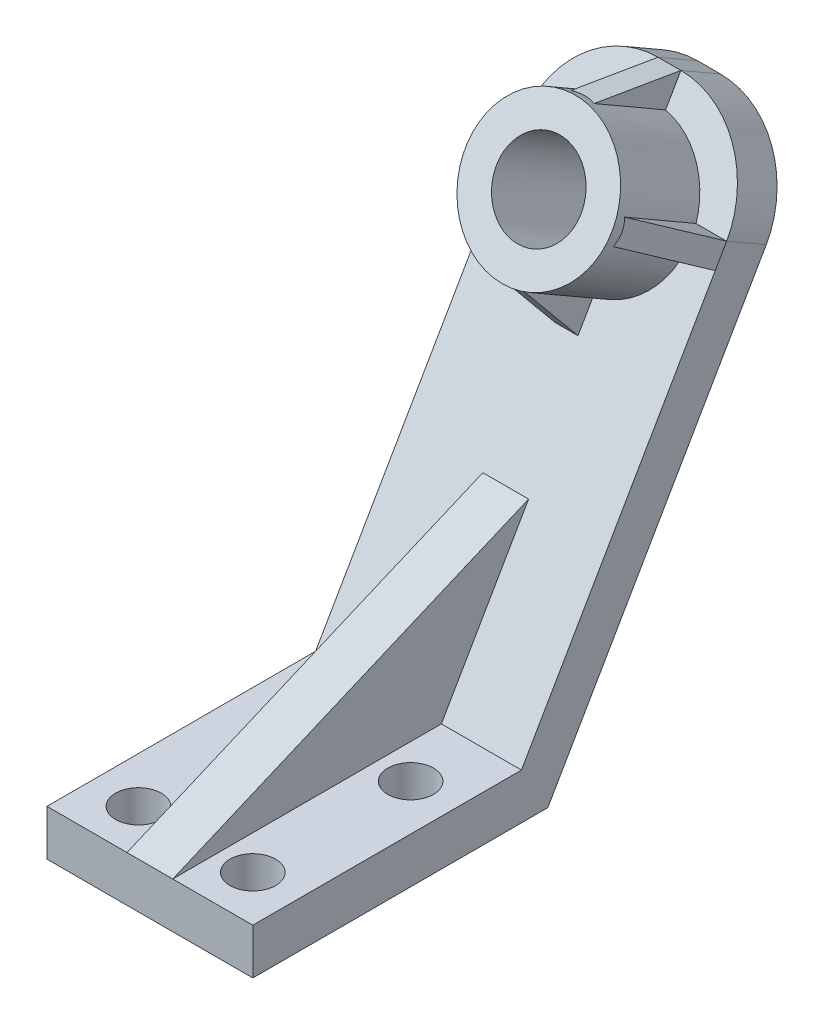
ISO-10303-21;
HEADER;
FILE_DESCRIPTION(('STEP AP214'),'2;1');
FILE_NAME('part.step','',(''),(''),'','','');
FILE_SCHEMA(('AUTOMOTIVE_DESIGN { 1 0 10303 214 1 1 1 1 }'));
ENDSEC;
DATA;
#1=APPLICATION_CONTEXT('core data for automotive mechanical design processes');
#2=APPLICATION_PROTOCOL_DEFINITION('international standard','automotive_design',2000,#1);
#3=PRODUCT_CONTEXT('',#1,'mechanical');
#4=PRODUCT('Part','Part','',(#3));
#5=PRODUCT_RELATED_PRODUCT_CATEGORY('part','',(#4));
#6=PRODUCT_DEFINITION_FORMATION('','',#4);
#7=PRODUCT_DEFINITION_CONTEXT('part definition',#1,'design');
#8=PRODUCT_DEFINITION('design','',#6,#7);
#9=PRODUCT_DEFINITION_SHAPE('','',#8);
#10=(LENGTH_UNIT() NAMED_UNIT(*) SI_UNIT(.MILLI.,.METRE.));
#11=(NAMED_UNIT(*) PLANE_ANGLE_UNIT() SI_UNIT($,.RADIAN.));
#12=(NAMED_UNIT(*) SI_UNIT($,.STERADIAN.) SOLID_ANGLE_UNIT());
#13=UNCERTAINTY_MEASURE_WITH_UNIT(LENGTH_MEASURE(1.E-05),#10,'distance_accuracy_value','');
#14=(GEOMETRIC_REPRESENTATION_CONTEXT(3) GLOBAL_UNCERTAINTY_ASSIGNED_CONTEXT((#13)) GLOBAL_UNIT_ASSIGNED_CONTEXT((#10,
#11,#12)) REPRESENTATION_CONTEXT('',''));
#15=CARTESIAN_POINT('',(0.,0.,0.));
#16=DIRECTION('',(0.,0.,1.));
#17=DIRECTION('',(1.,0.,0.));
#18=AXIS2_PLACEMENT_3D('',#15,#16,#17);
#19=CARTESIAN_POINT('',(45.,210.051868274206,-227.179491924311));
#20=DIRECTION('',(0.,-0.499999999999998,-0.86602540378444));
#21=DIRECTION('',(0.,0.86602540378444,-0.499999999999998));
#22=AXIS2_PLACEMENT_3D('',#19,#20,#21);
#23=PLANE('',#22);
#24=DIRECTION('',(-1.,0.,0.));
#25=VECTOR('',#24,1.);
#26=CARTESIAN_POINT('',(45.0000000000004,175.410852122828,-207.179491924311));
#27=LINE('',#26,#25);
#28=CARTESIAN_POINT('',(45.,175.410852122828,-207.179491924311));
#29=VERTEX_POINT('',#28);
#30=CARTESIAN_POINT('',(31.6069612585582,175.410852122828,-207.179491924311));
#31=VERTEX_POINT('',#30);
#32=EDGE_CURVE('E186',#29,#31,#27,.T.);
#33=ORIENTED_EDGE('',*,*,#32,.F.);
#34=CARTESIAN_POINT('',(5.,175.410852122828,-207.179491924311));
#35=DIRECTION('',(0.,-0.499999999999998,-0.86602540378444));
#36=DIRECTION('',(0.,0.86602540378444,-0.499999999999998));
#37=AXIS2_PLACEMENT_3D('',#34,#35,#36);
#38=CIRCLE('',#37,40.);
#39=CARTESIAN_POINT('',(5.00000000000001,210.051868274206,-227.179491924311));
#40=VERTEX_POINT('',#39);
#41=EDGE_CURVE('E361',#29,#40,#38,.F.);
#42=ORIENTED_EDGE('',*,*,#41,.T.);
#43=DIRECTION('',(0.,-0.86602540378444,0.499999999999998));
#44=VECTOR('',#43,1.);
#45=CARTESIAN_POINT('',(5.,210.051868274206,-227.179491924311));
#46=LINE('',#45,#44);
#47=CARTESIAN_POINT('',(5.,198.453156490248,-220.48297255359));
#48=VERTEX_POINT('',#47);
#49=EDGE_CURVE('E254',#40,#48,#46,.T.);
#50=ORIENTED_EDGE('',*,*,#49,.T.);
#51=CARTESIAN_POINT('',(0.,171.080725103906,-204.679491924311));
#52=DIRECTION('',(0.,-0.499999999999998,-0.86602540378444));
#53=DIRECTION('',(0.,0.86602540378444,-0.499999999999998));
#54=AXIS2_PLACEMENT_3D('',#51,#52,#53);
#55=CIRCLE('',#54,32.);
#56=EDGE_CURVE('E42',#31,#48,#55,.F.);
#57=ORIENTED_EDGE('',*,*,#56,.F.);
#58=EDGE_LOOP('',(#33,#42,#50,#57));
#59=FACE_BOUND('',#58,.T.);
#60=ADVANCED_FACE('F33',(#59),#23,.F.);
#61=CARTESIAN_POINT('',(-5.,175.410852122828,-207.179491924311));
#62=DIRECTION('',(0.,-0.499999999999998,-0.86602540378444));
#63=DIRECTION('',(0.,0.86602540378444,-0.499999999999998));
#64=AXIS2_PLACEMENT_3D('',#61,#62,#63);
#65=CIRCLE('',#64,40.);
#66=CARTESIAN_POINT('',(-4.99999999999998,210.051868274206,-227.179491924311));
#67=VERTEX_POINT('',#66);
#68=CARTESIAN_POINT('',(-45.,175.410852122828,-207.179491924311));
#69=VERTEX_POINT('',#68);
#70=EDGE_CURVE('E359',#67,#69,#65,.F.);
#71=ORIENTED_EDGE('',*,*,#70,.T.);
#72=DIRECTION('',(1.,0.,0.));
#73=VECTOR('',#72,1.);
#74=CARTESIAN_POINT('',(45.0000000000001,175.410852122828,-207.179491924311));
#75=LINE('',#74,#73);
#76=CARTESIAN_POINT('',(-31.6069612585582,175.410852122828,-207.179491924311));
#77=VERTEX_POINT('',#76);
#78=EDGE_CURVE('E237',#69,#77,#75,.T.);
#79=ORIENTED_EDGE('',*,*,#78,.T.);
#80=CARTESIAN_POINT('',(-5.,198.453156490248,-220.48297255359));
#81=VERTEX_POINT('',#80);
#82=EDGE_CURVE('E11',#81,#77,#55,.F.);
#83=ORIENTED_EDGE('',*,*,#82,.F.);
#84=DIRECTION('',(0.,-0.86602540378444,0.499999999999998));
#85=VECTOR('',#84,1.);
#86=CARTESIAN_POINT('',(-5.,210.051868274206,-227.179491924311));
#87=LINE('',#86,#85);
#88=EDGE_CURVE('E246',#67,#81,#87,.T.);
#89=ORIENTED_EDGE('',*,*,#88,.F.);
#90=EDGE_LOOP('',(#71,#79,#83,#89));
#91=FACE_BOUND('',#90,.T.);
#92=ADVANCED_FACE('F406',(#91),#23,.F.);
#93=CARTESIAN_POINT('',(45.,20.,-117.452994616208));
#94=DIRECTION('',(0.,-1.,0.));
#95=DIRECTION('',(0.,0.,-1.));
#96=AXIS2_PLACEMENT_3D('',#93,#94,#95);
#97=PLANE('',#96);
#98=CARTESIAN_POINT('',(-25.,20.,-89.));
#99=DIRECTION('',(0.,1.,0.));
#100=DIRECTION('',(0.,0.,1.));
#101=AXIS2_PLACEMENT_3D('',#98,#99,#100);
#102=CIRCLE('',#101,10.);
#103=CARTESIAN_POINT('',(-25.,20.,-79.));
#104=VERTEX_POINT('',#103);
#105=EDGE_CURVE('E275',#104,#104,#102,.T.);
#106=ORIENTED_EDGE('',*,*,#105,.F.);
#107=EDGE_LOOP('',(#106));
#108=FACE_BOUND('',#107,.T.);
#109=CARTESIAN_POINT('',(-25.,20.,-20.));
#110=DIRECTION('',(0.,1.,0.));
#111=DIRECTION('',(0.,0.,1.));
#112=AXIS2_PLACEMENT_3D('',#109,#110,#111);
#113=CIRCLE('',#112,10.);
#114=CARTESIAN_POINT('',(-25.,20.,-9.99999999999999));
#115=VERTEX_POINT('',#114);
#116=EDGE_CURVE('E274',#115,#115,#113,.T.);
#117=ORIENTED_EDGE('',*,*,#116,.F.);
#118=EDGE_LOOP('',(#117));
#119=FACE_BOUND('',#118,.T.);
#120=DIRECTION('',(0.,0.,1.));
#121=VECTOR('',#120,1.);
#122=CARTESIAN_POINT('',(-10.,20.,-117.452994616208));
#123=LINE('',#122,#121);
#124=CARTESIAN_POINT('',(-9.99999999999999,20.,-117.452994616208));
#125=VERTEX_POINT('',#124);
#126=CARTESIAN_POINT('',(-10.,20.,0.));
#127=VERTEX_POINT('',#126);
#128=EDGE_CURVE('E351',#125,#127,#123,.T.);
#129=ORIENTED_EDGE('',*,*,#128,.F.);
#130=DIRECTION('',(-1.,0.,0.));
#131=VECTOR('',#130,1.);
#132=CARTESIAN_POINT('',(45.,20.,-117.452994616208));
#133=LINE('',#132,#131);
#134=CARTESIAN_POINT('',(-45.,20.,-117.452994616208));
#135=VERTEX_POINT('',#134);
#136=EDGE_CURVE('E336',#125,#135,#133,.T.);
#137=ORIENTED_EDGE('',*,*,#136,.T.);
#138=DIRECTION('',(0.,0.,1.));
#139=VECTOR('',#138,1.);
#140=CARTESIAN_POINT('',(-45.,20.,-117.452994616208));
#141=LINE('',#140,#139);
#142=CARTESIAN_POINT('',(-45.,20.,0.));
#143=VERTEX_POINT('',#142);
#144=EDGE_CURVE('E312',#135,#143,#141,.T.);
#145=ORIENTED_EDGE('',*,*,#144,.T.);
#146=DIRECTION('',(-1.,0.,0.));
#147=VECTOR('',#146,1.);
#148=CARTESIAN_POINT('',(45.,20.,0.));
#149=LINE('',#148,#147);
#150=EDGE_CURVE('E319',#127,#143,#149,.T.);
#151=ORIENTED_EDGE('',*,*,#150,.F.);
#152=EDGE_LOOP('',(#129,#137,#145,#151));
#153=FACE_BOUND('',#152,.T.);
#154=ADVANCED_FACE('F412',(#108,#119,#153),#97,.F.);
#155=CARTESIAN_POINT('',(45.,0.,0.));
#156=DIRECTION('',(0.,0.,-1.));
#157=DIRECTION('',(-1.,0.,0.));
#158=AXIS2_PLACEMENT_3D('',#155,#156,#157);
#159=PLANE('',#158);
#160=CARTESIAN_POINT('',(10.,20.,0.));
#161=VERTEX_POINT('',#160);
#162=EDGE_CURVE('E337',#161,#127,#149,.T.);
#163=ORIENTED_EDGE('',*,*,#162,.T.);
#164=ORIENTED_EDGE('',*,*,#150,.T.);
#165=DIRECTION('',(0.,-1.,0.));
#166=VECTOR('',#165,1.);
#167=CARTESIAN_POINT('',(-45.,0.,0.));
#168=LINE('',#167,#166);
#169=CARTESIAN_POINT('',(-45.,0.,0.));
#170=VERTEX_POINT('',#169);
#171=EDGE_CURVE('E307',#143,#170,#168,.T.);
#172=ORIENTED_EDGE('',*,*,#171,.T.);
#173=DIRECTION('',(-1.,0.,0.));
#174=VECTOR('',#173,1.);
#175=CARTESIAN_POINT('',(45.,0.,0.));
#176=LINE('',#175,#174);
#177=CARTESIAN_POINT('',(45.,0.,0.));
#178=VERTEX_POINT('',#177);
#179=EDGE_CURVE('E349',#178,#170,#176,.T.);
#180=ORIENTED_EDGE('',*,*,#179,.F.);
#181=DIRECTION('',(0.,-1.,0.));
#182=VECTOR('',#181,1.);
#183=CARTESIAN_POINT('',(45.,0.,0.));
#184=LINE('',#183,#182);
#185=CARTESIAN_POINT('',(45.,20.,0.));
#186=VERTEX_POINT('',#185);
#187=EDGE_CURVE('E308',#186,#178,#184,.T.);
#188=ORIENTED_EDGE('',*,*,#187,.F.);
#189=EDGE_CURVE('E333',#186,#161,#149,.T.);
#190=ORIENTED_EDGE('',*,*,#189,.T.);
#191=EDGE_LOOP('',(#163,#164,#172,#180,#188,#190));
#192=FACE_BOUND('',#191,.T.);
#193=ADVANCED_FACE('F437',(#192),#159,.F.);
#194=CARTESIAN_POINT('',(45.,0.,0.));
#195=DIRECTION('',(0.,1.,0.));
#196=DIRECTION('',(0.,0.,1.));
#197=AXIS2_PLACEMENT_3D('',#194,#195,#196);
#198=PLANE('',#197);
#199=CARTESIAN_POINT('',(25.,0.,-20.));
#200=DIRECTION('',(0.,1.,0.));
#201=DIRECTION('',(0.,0.,-1.));
#202=AXIS2_PLACEMENT_3D('',#199,#200,#201);
#203=CIRCLE('',#202,10.);
#204=CARTESIAN_POINT('',(25.,0.,-30.));
#205=VERTEX_POINT('',#204);
#206=EDGE_CURVE('E278',#205,#205,#203,.T.);
#207=ORIENTED_EDGE('',*,*,#206,.T.);
#208=EDGE_LOOP('',(#207));
#209=FACE_BOUND('',#208,.T.);
#210=CARTESIAN_POINT('',(25.,0.,-89.));
#211=DIRECTION('',(0.,1.,0.));
#212=DIRECTION('',(0.,0.,-1.));
#213=AXIS2_PLACEMENT_3D('',#210,#211,#212);
#214=CIRCLE('',#213,10.);
#215=CARTESIAN_POINT('',(25.,0.,-98.9999999999999));
#216=VERTEX_POINT('',#215);
#217=EDGE_CURVE('E284',#216,#216,#214,.T.);
#218=ORIENTED_EDGE('',*,*,#217,.T.);
#219=EDGE_LOOP('',(#218));
#220=FACE_BOUND('',#219,.T.);
#221=ORIENTED_EDGE('',*,*,#179,.T.);
#222=DIRECTION('',(0.,0.,-1.));
#223=VECTOR('',#222,1.);
#224=CARTESIAN_POINT('',(-45.,0.,0.));
#225=LINE('',#224,#223);
#226=CARTESIAN_POINT('',(-45.,0.,-129.));
#227=VERTEX_POINT('',#226);
#228=EDGE_CURVE('E322',#170,#227,#225,.T.);
#229=ORIENTED_EDGE('',*,*,#228,.T.);
#230=DIRECTION('',(-1.,0.,0.));
#231=VECTOR('',#230,1.);
#232=CARTESIAN_POINT('',(45.,0.,-129.));
#233=LINE('',#232,#231);
#234=CARTESIAN_POINT('',(45.,0.,-129.));
#235=VERTEX_POINT('',#234);
#236=EDGE_CURVE('E347',#235,#227,#233,.T.);
#237=ORIENTED_EDGE('',*,*,#236,.F.);
#238=DIRECTION('',(0.,0.,-1.));
#239=VECTOR('',#238,1.);
#240=CARTESIAN_POINT('',(45.,0.,0.));
#241=LINE('',#240,#239);
#242=EDGE_CURVE('E311',#178,#235,#241,.T.);
#243=ORIENTED_EDGE('',*,*,#242,.F.);
#244=EDGE_LOOP('',(#221,#229,#237,#243));
#245=FACE_BOUND('',#244,.T.);
#246=CARTESIAN_POINT('',(-25.,0.,-20.));
#247=DIRECTION('',(0.,1.,0.));
#248=DIRECTION('',(0.,0.,1.));
#249=AXIS2_PLACEMENT_3D('',#246,#247,#248);
#250=CIRCLE('',#249,10.);
#251=CARTESIAN_POINT('',(-25.,0.,-10.));
#252=VERTEX_POINT('',#251);
#253=EDGE_CURVE('E289',#252,#252,#250,.T.);
#254=ORIENTED_EDGE('',*,*,#253,.T.);
#255=EDGE_LOOP('',(#254));
#256=FACE_BOUND('',#255,.T.);
#257=CARTESIAN_POINT('',(-25.,0.,-89.));
#258=DIRECTION('',(0.,1.,0.));
#259=DIRECTION('',(0.,0.,1.));
#260=AXIS2_PLACEMENT_3D('',#257,#258,#259);
#261=CIRCLE('',#260,10.);
#262=CARTESIAN_POINT('',(-25.,0.,-79.));
#263=VERTEX_POINT('',#262);
#264=EDGE_CURVE('E271',#263,#263,#261,.T.);
#265=ORIENTED_EDGE('',*,*,#264,.T.);
#266=EDGE_LOOP('',(#265));
#267=FACE_BOUND('',#266,.T.);
#268=ADVANCED_FACE('F430',(#209,#220,#245,#256,#267),#198,.F.);
#269=CARTESIAN_POINT('',(45.,0.,-129.));
#270=DIRECTION('',(0.,0.499999999999998,0.86602540378444));
#271=DIRECTION('',(0.,-0.86602540378444,0.499999999999998));
#272=AXIS2_PLACEMENT_3D('',#269,#270,#271);
#273=PLANE('',#272);
#274=CARTESIAN_POINT('',(0.,161.080725103906,-222.));
#275=DIRECTION('',(0.,0.499999999999998,0.86602540378444));
#276=DIRECTION('',(0.,-0.86602540378444,0.499999999999998));
#277=AXIS2_PLACEMENT_3D('',#274,#275,#276);
#278=CIRCLE('',#277,18.5);
#279=CARTESIAN_POINT('',(0.,145.059255133894,-212.75));
#280=VERTEX_POINT('',#279);
#281=EDGE_CURVE('E264',#280,#280,#278,.T.);
#282=ORIENTED_EDGE('',*,*,#281,.T.);
#283=EDGE_LOOP('',(#282));
#284=FACE_BOUND('',#283,.T.);
#285=DIRECTION('',(0.,0.86602540378444,-0.499999999999998));
#286=VECTOR('',#285,1.);
#287=CARTESIAN_POINT('',(-45.,0.,-129.));
#288=LINE('',#287,#286);
#289=CARTESIAN_POINT('',(-45.,165.410852122828,-224.5));
#290=VERTEX_POINT('',#289);
#291=EDGE_CURVE('E325',#227,#290,#288,.T.);
#292=ORIENTED_EDGE('',*,*,#291,.T.);
#293=CARTESIAN_POINT('',(-5.,165.410852122828,-224.5));
#294=DIRECTION('',(0.,0.499999999999998,0.86602540378444));
#295=DIRECTION('',(0.,-0.86602540378444,0.499999999999998));
#296=AXIS2_PLACEMENT_3D('',#293,#294,#295);
#297=CIRCLE('',#296,40.);
#298=CARTESIAN_POINT('',(-4.99999999999998,200.051868274206,-244.499999999999));
#299=VERTEX_POINT('',#298);
#300=EDGE_CURVE('E368',#290,#299,#297,.F.);
#301=ORIENTED_EDGE('',*,*,#300,.T.);
#302=DIRECTION('',(-1.,0.,0.));
#303=VECTOR('',#302,1.);
#304=CARTESIAN_POINT('',(45.,200.051868274206,-244.499999999999));
#305=LINE('',#304,#303);
#306=CARTESIAN_POINT('',(5.00000000000001,200.051868274206,-244.499999999999));
#307=VERTEX_POINT('',#306);
#308=EDGE_CURVE('E344',#307,#299,#305,.T.);
#309=ORIENTED_EDGE('',*,*,#308,.F.);
#310=CARTESIAN_POINT('',(5.,165.410852122828,-224.5));
#311=DIRECTION('',(0.,0.499999999999998,0.86602540378444));
#312=DIRECTION('',(0.,-0.86602540378444,0.499999999999998));
#313=AXIS2_PLACEMENT_3D('',#310,#311,#312);
#314=CIRCLE('',#313,40.);
#315=CARTESIAN_POINT('',(45.,165.410852122828,-224.5));
#316=VERTEX_POINT('',#315);
#317=EDGE_CURVE('E370',#307,#316,#314,.F.);
#318=ORIENTED_EDGE('',*,*,#317,.T.);
#319=DIRECTION('',(0.,0.86602540378444,-0.499999999999998));
#320=VECTOR('',#319,1.);
#321=CARTESIAN_POINT('',(45.,0.,-129.));
#322=LINE('',#321,#320);
#323=EDGE_CURVE('E314',#235,#316,#322,.T.);
#324=ORIENTED_EDGE('',*,*,#323,.F.);
#325=ORIENTED_EDGE('',*,*,#236,.T.);
#326=EDGE_LOOP('',(#292,#301,#309,#318,#324,#325));
#327=FACE_BOUND('',#326,.T.);
#328=ADVANCED_FACE('F425',(#284,#327),#273,.F.);
#329=CARTESIAN_POINT('',(45.,200.051868274206,-244.499999999999));
#330=DIRECTION('',(0.,-0.86602540378444,0.499999999999998));
#331=DIRECTION('',(0.,-0.499999999999998,-0.86602540378444));
#332=AXIS2_PLACEMENT_3D('',#329,#330,#331);
#333=PLANE('',#332);
#334=DIRECTION('',(-1.,0.,0.));
#335=VECTOR('',#334,1.);
#336=CARTESIAN_POINT('',(45.,210.051868274206,-227.179491924311));
#337=LINE('',#336,#335);
#338=EDGE_CURVE('E341',#40,#67,#337,.T.);
#339=ORIENTED_EDGE('',*,*,#338,.F.);
#340=DIRECTION('',(0.,0.499999999999998,0.86602540378444));
#341=VECTOR('',#340,1.);
#342=CARTESIAN_POINT('',(5.,200.051868274206,-244.499999999999));
#343=LINE('',#342,#341);
#344=EDGE_CURVE('E366',#40,#307,#343,.F.);
#345=ORIENTED_EDGE('',*,*,#344,.T.);
#346=ORIENTED_EDGE('',*,*,#308,.T.);
#347=DIRECTION('',(0.,0.499999999999998,0.86602540378444));
#348=VECTOR('',#347,1.);
#349=CARTESIAN_POINT('',(-5.,200.051868274206,-244.499999999999));
#350=LINE('',#349,#348);
#351=EDGE_CURVE('E363',#299,#67,#350,.T.);
#352=ORIENTED_EDGE('',*,*,#351,.T.);
#353=EDGE_LOOP('',(#339,#345,#346,#352));
#354=FACE_BOUND('',#353,.T.);
#355=ADVANCED_FACE('F418',(#354),#333,.F.);
#356=DIRECTION('',(0.,-0.86602540378444,0.499999999999998));
#357=VECTOR('',#356,1.);
#358=CARTESIAN_POINT('',(45.,210.051868274206,-227.179491924311));
#359=LINE('',#358,#357);
#360=CARTESIAN_POINT('',(45.,166.750598084984,-202.179491924311));
#361=VERTEX_POINT('',#360);
#362=CARTESIAN_POINT('',(45.,20.,-117.452994616208));
#363=VERTEX_POINT('',#362);
#364=EDGE_CURVE('E49',#361,#363,#359,.T.);
#365=ORIENTED_EDGE('',*,*,#364,.F.);
#366=DIRECTION('',(-1.,0.,0.));
#367=VECTOR('',#366,1.);
#368=CARTESIAN_POINT('',(45.0000000000005,166.750598084984,-202.179491924311));
#369=LINE('',#368,#367);
#370=CARTESIAN_POINT('',(31.6069612585583,166.750598084984,-202.179491924311));
#371=VERTEX_POINT('',#370);
#372=EDGE_CURVE('E199',#361,#371,#369,.T.);
#373=ORIENTED_EDGE('',*,*,#372,.T.);
#374=CARTESIAN_POINT('',(5.,143.708293717564,-188.876011295032));
#375=VERTEX_POINT('',#374);
#376=EDGE_CURVE('E379',#375,#371,#55,.F.);
#377=ORIENTED_EDGE('',*,*,#376,.F.);
#378=DIRECTION('',(0.,0.86602540378444,-0.499999999999998));
#379=VECTOR('',#378,1.);
#380=CARTESIAN_POINT('',(5.,210.051868274206,-227.179491924311));
#381=LINE('',#380,#379);
#382=CARTESIAN_POINT('',(5.,132.109581933606,-182.179491924311));
#383=VERTEX_POINT('',#382);
#384=EDGE_CURVE('E217',#383,#375,#381,.T.);
#385=ORIENTED_EDGE('',*,*,#384,.F.);
#386=DIRECTION('',(1.,0.,0.));
#387=VECTOR('',#386,1.);
#388=CARTESIAN_POINT('',(45.,132.109581933606,-182.179491924311));
#389=LINE('',#388,#387);
#390=CARTESIAN_POINT('',(-5.,132.109581933606,-182.179491924311));
#391=VERTEX_POINT('',#390);
#392=EDGE_CURVE('E222',#383,#391,#389,.F.);
#393=ORIENTED_EDGE('',*,*,#392,.T.);
#394=DIRECTION('',(0.,0.86602540378444,-0.499999999999998));
#395=VECTOR('',#394,1.);
#396=CARTESIAN_POINT('',(-5.,210.051868274206,-227.179491924311));
#397=LINE('',#396,#395);
#398=CARTESIAN_POINT('',(-5.,143.708293717564,-188.876011295032));
#399=VERTEX_POINT('',#398);
#400=EDGE_CURVE('E212',#391,#399,#397,.T.);
#401=ORIENTED_EDGE('',*,*,#400,.T.);
#402=CARTESIAN_POINT('',(-31.6069612585582,166.750598084984,-202.179491924311));
#403=VERTEX_POINT('',#402);
#404=EDGE_CURVE('E41',#403,#399,#55,.F.);
#405=ORIENTED_EDGE('',*,*,#404,.F.);
#406=DIRECTION('',(1.,0.,0.));
#407=VECTOR('',#406,1.);
#408=CARTESIAN_POINT('',(45.0000000000002,166.750598084984,-202.179491924311));
#409=LINE('',#408,#407);
#410=CARTESIAN_POINT('',(-45.,166.750598084984,-202.179491924311));
#411=VERTEX_POINT('',#410);
#412=EDGE_CURVE('E228',#411,#403,#409,.T.);
#413=ORIENTED_EDGE('',*,*,#412,.F.);
#414=DIRECTION('',(0.,-0.86602540378444,0.499999999999998));
#415=VECTOR('',#414,1.);
#416=CARTESIAN_POINT('',(-45.,210.051868274206,-227.179491924311));
#417=LINE('',#416,#415);
#418=EDGE_CURVE('E327',#411,#135,#417,.T.);
#419=ORIENTED_EDGE('',*,*,#418,.T.);
#420=ORIENTED_EDGE('',*,*,#136,.F.);
#421=DIRECTION('',(0.,-0.86602540378444,0.499999999999998));
#422=VECTOR('',#421,1.);
#423=CARTESIAN_POINT('',(-10.,210.051868274206,-227.179491924311));
#424=LINE('',#423,#422);
#425=CARTESIAN_POINT('',(-10.,86.04040267284,-155.581438876763));
#426=VERTEX_POINT('',#425);
#427=EDGE_CURVE('E298',#426,#125,#424,.T.);
#428=ORIENTED_EDGE('',*,*,#427,.F.);
#429=DIRECTION('',(-1.,0.,0.));
#430=VECTOR('',#429,1.);
#431=CARTESIAN_POINT('',(45.,86.0404026728399,-155.581438876763));
#432=LINE('',#431,#430);
#433=CARTESIAN_POINT('',(9.99999999999999,86.0404026728399,-155.581438876763));
#434=VERTEX_POINT('',#433);
#435=EDGE_CURVE('E305',#426,#434,#432,.F.);
#436=ORIENTED_EDGE('',*,*,#435,.T.);
#437=DIRECTION('',(0.,-0.86602540378444,0.499999999999998));
#438=VECTOR('',#437,1.);
#439=CARTESIAN_POINT('',(10.,210.051868274206,-227.179491924311));
#440=LINE('',#439,#438);
#441=CARTESIAN_POINT('',(10.,20.,-117.452994616208));
#442=VERTEX_POINT('',#441);
#443=EDGE_CURVE('E303',#434,#442,#440,.T.);
#444=ORIENTED_EDGE('',*,*,#443,.T.);
#445=EDGE_CURVE('E338',#363,#442,#133,.T.);
#446=ORIENTED_EDGE('',*,*,#445,.F.);
#447=EDGE_LOOP('',(#365,#373,#377,#385,#393,#401,#405,#413,#419,#420,#428,#436,#444,#446));
#448=FACE_BOUND('',#447,.T.);
#449=ADVANCED_FACE('F395',(#448),#23,.F.);
#450=CARTESIAN_POINT('',(25.,20.,-20.));
#451=DIRECTION('',(0.,1.,0.));
#452=DIRECTION('',(0.,0.,-1.));
#453=AXIS2_PLACEMENT_3D('',#450,#451,#452);
#454=CIRCLE('',#453,10.);
#455=CARTESIAN_POINT('',(25.,20.,-30.));
#456=VERTEX_POINT('',#455);
#457=EDGE_CURVE('E281',#456,#456,#454,.T.);
#458=ORIENTED_EDGE('',*,*,#457,.F.);
#459=EDGE_LOOP('',(#458));
#460=FACE_BOUND('',#459,.T.);
#461=CARTESIAN_POINT('',(25.,20.,-89.));
#462=DIRECTION('',(0.,1.,0.));
#463=DIRECTION('',(0.,0.,-1.));
#464=AXIS2_PLACEMENT_3D('',#461,#462,#463);
#465=CIRCLE('',#464,10.);
#466=CARTESIAN_POINT('',(25.,20.,-98.9999999999999));
#467=VERTEX_POINT('',#466);
#468=EDGE_CURVE('E270',#467,#467,#465,.T.);
#469=ORIENTED_EDGE('',*,*,#468,.F.);
#470=EDGE_LOOP('',(#469));
#471=FACE_BOUND('',#470,.T.);
#472=ORIENTED_EDGE('',*,*,#445,.T.);
#473=DIRECTION('',(0.,0.,1.));
#474=VECTOR('',#473,1.);
#475=CARTESIAN_POINT('',(10.,20.,-117.452994616208));
#476=LINE('',#475,#474);
#477=EDGE_CURVE('E354',#442,#161,#476,.T.);
#478=ORIENTED_EDGE('',*,*,#477,.T.);
#479=ORIENTED_EDGE('',*,*,#189,.F.);
#480=DIRECTION('',(0.,0.,1.));
#481=VECTOR('',#480,1.);
#482=CARTESIAN_POINT('',(45.,20.,-117.452994616208));
#483=LINE('',#482,#481);
#484=EDGE_CURVE('E317',#363,#186,#483,.T.);
#485=ORIENTED_EDGE('',*,*,#484,.F.);
#486=EDGE_LOOP('',(#472,#478,#479,#485));
#487=FACE_BOUND('',#486,.T.);
#488=ADVANCED_FACE('F417',(#460,#471,#487),#97,.F.);
#489=CARTESIAN_POINT('',(45.,0.,0.));
#490=DIRECTION('',(1.,0.,0.));
#491=DIRECTION('',(0.,0.,-1.));
#492=AXIS2_PLACEMENT_3D('',#489,#490,#491);
#493=PLANE('',#492);
#494=ORIENTED_EDGE('',*,*,#323,.T.);
#495=DIRECTION('',(0.,0.499999999999998,0.86602540378444));
#496=VECTOR('',#495,1.);
#497=CARTESIAN_POINT('',(45.,175.410852122828,-207.179491924311));
#498=LINE('',#497,#496);
#499=EDGE_CURVE('E356',#316,#29,#498,.T.);
#500=ORIENTED_EDGE('',*,*,#499,.T.);
#501=EDGE_CURVE('E196',#29,#361,#359,.T.);
#502=ORIENTED_EDGE('',*,*,#501,.T.);
#503=ORIENTED_EDGE('',*,*,#364,.T.);
#504=ORIENTED_EDGE('',*,*,#484,.T.);
#505=ORIENTED_EDGE('',*,*,#187,.T.);
#506=ORIENTED_EDGE('',*,*,#242,.T.);
#507=EDGE_LOOP('',(#494,#500,#502,#503,#504,#505,#506));
#508=FACE_BOUND('',#507,.T.);
#509=ADVANCED_FACE('F423',(#508),#493,.T.);
#510=CARTESIAN_POINT('',(-45.,0.,0.));
#511=DIRECTION('',(1.,0.,0.));
#512=DIRECTION('',(0.,0.,-1.));
#513=AXIS2_PLACEMENT_3D('',#510,#511,#512);
#514=PLANE('',#513);
#515=ORIENTED_EDGE('',*,*,#418,.F.);
#516=EDGE_CURVE('E328',#69,#411,#417,.T.);
#517=ORIENTED_EDGE('',*,*,#516,.F.);
#518=DIRECTION('',(0.,0.499999999999998,0.86602540378444));
#519=VECTOR('',#518,1.);
#520=CARTESIAN_POINT('',(-45.,221.269490666924,-127.749999999999));
#521=LINE('',#520,#519);
#522=EDGE_CURVE('E372',#69,#290,#521,.F.);
#523=ORIENTED_EDGE('',*,*,#522,.T.);
#524=ORIENTED_EDGE('',*,*,#291,.F.);
#525=ORIENTED_EDGE('',*,*,#228,.F.);
#526=ORIENTED_EDGE('',*,*,#171,.F.);
#527=ORIENTED_EDGE('',*,*,#144,.F.);
#528=EDGE_LOOP('',(#515,#517,#523,#524,#525,#526,#527));
#529=FACE_BOUND('',#528,.T.);
#530=ADVANCED_FACE('F466',(#529),#514,.F.);
#531=CARTESIAN_POINT('',(0.,20.,0.));
#532=DIRECTION('',(0.,-0.92050485345244,-0.390731128489275));
#533=DIRECTION('',(0.,0.390731128489275,-0.92050485345244));
#534=AXIS2_PLACEMENT_3D('',#531,#532,#533);
#535=PLANE('',#534);
#536=DIRECTION('',(0.,0.390731128489275,-0.92050485345244));
#537=VECTOR('',#536,1.);
#538=CARTESIAN_POINT('',(10.,20.,0.));
#539=LINE('',#538,#537);
#540=EDGE_CURVE('E295',#161,#434,#539,.T.);
#541=ORIENTED_EDGE('',*,*,#540,.T.);
#542=ORIENTED_EDGE('',*,*,#435,.F.);
#543=DIRECTION('',(0.,0.390731128489275,-0.92050485345244));
#544=VECTOR('',#543,1.);
#545=CARTESIAN_POINT('',(-10.,20.,0.));
#546=LINE('',#545,#544);
#547=EDGE_CURVE('E292',#127,#426,#546,.T.);
#548=ORIENTED_EDGE('',*,*,#547,.F.);
#549=ORIENTED_EDGE('',*,*,#162,.F.);
#550=EDGE_LOOP('',(#541,#542,#548,#549));
#551=FACE_BOUND('',#550,.T.);
#552=ADVANCED_FACE('F489',(#551),#535,.F.);
#553=CARTESIAN_POINT('',(10.,105.025934137103,-122.25));
#554=DIRECTION('',(1.,0.,0.));
#555=DIRECTION('',(0.,0.,-1.));
#556=AXIS2_PLACEMENT_3D('',#553,#554,#555);
#557=PLANE('',#556);
#558=ORIENTED_EDGE('',*,*,#443,.F.);
#559=ORIENTED_EDGE('',*,*,#540,.F.);
#560=ORIENTED_EDGE('',*,*,#477,.F.);
#561=EDGE_LOOP('',(#558,#559,#560));
#562=FACE_BOUND('',#561,.T.);
#563=ADVANCED_FACE('F494',(#562),#557,.T.);
#564=CARTESIAN_POINT('',(-10.,105.025934137103,-122.25));
#565=DIRECTION('',(1.,0.,0.));
#566=DIRECTION('',(0.,0.,-1.));
#567=AXIS2_PLACEMENT_3D('',#564,#565,#566);
#568=PLANE('',#567);
#569=ORIENTED_EDGE('',*,*,#547,.T.);
#570=ORIENTED_EDGE('',*,*,#427,.T.);
#571=ORIENTED_EDGE('',*,*,#128,.T.);
#572=EDGE_LOOP('',(#569,#570,#571));
#573=FACE_BOUND('',#572,.T.);
#574=ADVANCED_FACE('F486',(#573),#568,.F.);
#575=CARTESIAN_POINT('',(-25.,0.,-20.));
#576=DIRECTION('',(0.,1.,0.));
#577=DIRECTION('',(0.,0.,1.));
#578=AXIS2_PLACEMENT_3D('',#575,#576,#577);
#579=CYLINDRICAL_SURFACE('',#578,10.);
#580=ORIENTED_EDGE('',*,*,#253,.F.);
#581=EDGE_LOOP('',(#580));
#582=FACE_BOUND('',#581,.T.);
#583=ORIENTED_EDGE('',*,*,#116,.T.);
#584=EDGE_LOOP('',(#583));
#585=FACE_BOUND('',#584,.T.);
#586=ADVANCED_FACE('F512',(#582,#585),#579,.F.);
#587=CARTESIAN_POINT('',(25.,0.,-89.));
#588=DIRECTION('',(0.,1.,0.));
#589=DIRECTION('',(0.,0.,1.));
#590=AXIS2_PLACEMENT_3D('',#587,#588,#589);
#591=CYLINDRICAL_SURFACE('',#590,10.);
#592=ORIENTED_EDGE('',*,*,#217,.F.);
#593=EDGE_LOOP('',(#592));
#594=FACE_BOUND('',#593,.T.);
#595=ORIENTED_EDGE('',*,*,#468,.T.);
#596=EDGE_LOOP('',(#595));
#597=FACE_BOUND('',#596,.T.);
#598=ADVANCED_FACE('F514',(#594,#597),#591,.F.);
#599=CARTESIAN_POINT('',(25.,0.,-20.));
#600=DIRECTION('',(0.,1.,0.));
#601=DIRECTION('',(0.,0.,1.));
#602=AXIS2_PLACEMENT_3D('',#599,#600,#601);
#603=CYLINDRICAL_SURFACE('',#602,10.);
#604=ORIENTED_EDGE('',*,*,#206,.F.);
#605=EDGE_LOOP('',(#604));
#606=FACE_BOUND('',#605,.T.);
#607=ORIENTED_EDGE('',*,*,#457,.T.);
#608=EDGE_LOOP('',(#607));
#609=FACE_BOUND('',#608,.T.);
#610=ADVANCED_FACE('F450',(#606,#609),#603,.F.);
#611=CARTESIAN_POINT('',(-25.,0.,-89.));
#612=DIRECTION('',(0.,1.,0.));
#613=DIRECTION('',(0.,0.,1.));
#614=AXIS2_PLACEMENT_3D('',#611,#612,#613);
#615=CYLINDRICAL_SURFACE('',#614,10.);
#616=ORIENTED_EDGE('',*,*,#264,.F.);
#617=EDGE_LOOP('',(#616));
#618=FACE_BOUND('',#617,.T.);
#619=ORIENTED_EDGE('',*,*,#105,.T.);
#620=EDGE_LOOP('',(#619));
#621=FACE_BOUND('',#620,.T.);
#622=ADVANCED_FACE('F443',(#618,#621),#615,.F.);
#623=CARTESIAN_POINT('',(5.,221.269490666924,-127.749999999999));
#624=DIRECTION('',(0.,-0.499999999999998,-0.86602540378444));
#625=DIRECTION('',(0.,0.86602540378444,-0.499999999999998));
#626=AXIS2_PLACEMENT_3D('',#623,#624,#625);
#627=CYLINDRICAL_SURFACE('',#626,40.);
#628=ORIENTED_EDGE('',*,*,#317,.F.);
#629=ORIENTED_EDGE('',*,*,#344,.F.);
#630=ORIENTED_EDGE('',*,*,#41,.F.);
#631=ORIENTED_EDGE('',*,*,#499,.F.);
#632=EDGE_LOOP('',(#628,#629,#630,#631));
#633=FACE_BOUND('',#632,.T.);
#634=ADVANCED_FACE('F441',(#633),#627,.T.);
#635=CARTESIAN_POINT('',(-5.,165.410852122828,-224.5));
#636=DIRECTION('',(0.,0.499999999999998,0.86602540378444));
#637=DIRECTION('',(0.,-0.86602540378444,0.499999999999998));
#638=AXIS2_PLACEMENT_3D('',#635,#636,#637);
#639=CYLINDRICAL_SURFACE('',#638,40.);
#640=ORIENTED_EDGE('',*,*,#300,.F.);
#641=ORIENTED_EDGE('',*,*,#522,.F.);
#642=ORIENTED_EDGE('',*,*,#70,.F.);
#643=ORIENTED_EDGE('',*,*,#351,.F.);
#644=EDGE_LOOP('',(#640,#641,#642,#643));
#645=FACE_BOUND('',#644,.T.);
#646=ADVANCED_FACE('F35',(#645),#639,.T.);
#647=CARTESIAN_POINT('',(0.,191.080725103906,-170.038475772933));
#648=DIRECTION('',(0.,-0.499999999999998,-0.86602540378444));
#649=DIRECTION('',(0.,0.86602540378444,-0.499999999999998));
#650=AXIS2_PLACEMENT_3D('',#647,#648,#649);
#651=CYLINDRICAL_SURFACE('',#650,32.);
#652=CARTESIAN_POINT('',(0.,231.657648180829,-99.7571833888884));
#653=DIRECTION('',(0.937425272009765,-0.17409326480181,-0.301538379892286));
#654=DIRECTION('',(-0.348186529603627,-0.468712636004881,-0.811834099709995));
#655=AXIS2_PLACEMENT_3D('',#652,#653,#654);
#656=ELLIPSE('',#655,91.9047616127728,32.);
#657=CARTESIAN_POINT('',(-31.6069612585583,193.439942736307,-175.952190967502));
#658=VERTEX_POINT('',#657);
#659=CARTESIAN_POINT('',(-31.6069612585582,184.779688698463,-170.952190967502));
#660=VERTEX_POINT('',#659);
#661=EDGE_CURVE('E239',#658,#660,#656,.F.);
#662=ORIENTED_EDGE('',*,*,#661,.T.);
#663=DIRECTION('',(0.,-0.499999999999998,-0.86602540378444));
#664=VECTOR('',#663,1.);
#665=CARTESIAN_POINT('',(-31.6069612585582,186.750598084983,-167.538475772933));
#666=LINE('',#665,#664);
#667=EDGE_CURVE('E233',#403,#660,#666,.F.);
#668=ORIENTED_EDGE('',*,*,#667,.F.);
#669=ORIENTED_EDGE('',*,*,#404,.T.);
#670=DIRECTION('',(0.,-0.499999999999998,-0.86602540378444));
#671=VECTOR('',#670,1.);
#672=CARTESIAN_POINT('',(-5.,163.708293717564,-154.234995143654));
#673=LINE('',#672,#671);
#674=CARTESIAN_POINT('',(-5.,161.737384331043,-157.648710338222));
#675=VERTEX_POINT('',#674);
#676=EDGE_CURVE('E208',#399,#675,#673,.F.);
#677=ORIENTED_EDGE('',*,*,#676,.T.);
#678=CARTESIAN_POINT('',(0.,231.657648180829,-99.7571833888883));
#679=DIRECTION('',(0.,0.637740834908183,-0.770251015897164));
#680=DIRECTION('',(0.,-0.770251015897165,-0.637740834908183));
#681=AXIS2_PLACEMENT_3D('',#678,#679,#680);
#682=ELLIPSE('',#681,91.9047616127728,32.);
#683=CARTESIAN_POINT('',(5.,161.737384331043,-157.648710338222));
#684=VERTEX_POINT('',#683);
#685=EDGE_CURVE('E220',#675,#684,#682,.F.);
#686=ORIENTED_EDGE('',*,*,#685,.T.);
#687=DIRECTION('',(0.,-0.499999999999998,-0.86602540378444));
#688=VECTOR('',#687,1.);
#689=CARTESIAN_POINT('',(5.,163.708293717564,-154.234995143654));
#690=LINE('',#689,#688);
#691=EDGE_CURVE('E214',#375,#684,#690,.F.);
#692=ORIENTED_EDGE('',*,*,#691,.F.);
#693=ORIENTED_EDGE('',*,*,#376,.T.);
#694=DIRECTION('',(0.,-0.499999999999998,-0.86602540378444));
#695=VECTOR('',#694,1.);
#696=CARTESIAN_POINT('',(31.6069612585583,186.750598084984,-167.538475772933));
#697=LINE('',#696,#695);
#698=CARTESIAN_POINT('',(31.6069612585583,184.779688698463,-170.952190967502));
#699=VERTEX_POINT('',#698);
#700=EDGE_CURVE('E57',#371,#699,#697,.F.);
#701=ORIENTED_EDGE('',*,*,#700,.T.);
#702=CARTESIAN_POINT('',(0.,231.657648180829,-99.7571833888883));
#703=DIRECTION('',(-0.937425272009765,-0.174093264801821,-0.301538379892279));
#704=DIRECTION('',(0.348186529603627,-0.468712636004877,-0.811834099709997));
#705=AXIS2_PLACEMENT_3D('',#702,#703,#704);
#706=ELLIPSE('',#705,91.9047616127727,32.);
#707=CARTESIAN_POINT('',(31.6069612585582,193.439942736308,-175.952190967502));
#708=VERTEX_POINT('',#707);
#709=EDGE_CURVE('E175',#699,#708,#706,.F.);
#710=ORIENTED_EDGE('',*,*,#709,.T.);
#711=DIRECTION('',(0.,-0.499999999999998,-0.86602540378444));
#712=VECTOR('',#711,1.);
#713=CARTESIAN_POINT('',(31.6069612585582,195.410852122828,-172.538475772933));
#714=LINE('',#713,#712);
#715=EDGE_CURVE('E179',#31,#708,#714,.F.);
#716=ORIENTED_EDGE('',*,*,#715,.F.);
#717=ORIENTED_EDGE('',*,*,#56,.T.);
#718=DIRECTION('',(0.,-0.499999999999998,-0.86602540378444));
#719=VECTOR('',#718,1.);
#720=CARTESIAN_POINT('',(5.,218.453156490248,-185.841956402212));
#721=LINE('',#720,#719);
#722=CARTESIAN_POINT('',(5.,216.482247103727,-189.255671596781));
#723=VERTEX_POINT('',#722);
#724=EDGE_CURVE('E257',#48,#723,#721,.F.);
#725=ORIENTED_EDGE('',*,*,#724,.T.);
#726=CARTESIAN_POINT('',(0.,231.657648180829,-99.7571833888884));
#727=DIRECTION('',(0.,-0.985927364511808,0.167174256112596));
#728=DIRECTION('',(0.,-0.167174256112596,-0.985927364511809));
#729=AXIS2_PLACEMENT_3D('',#726,#727,#728);
#730=ELLIPSE('',#729,91.9047616127727,32.);
#731=CARTESIAN_POINT('',(-5.,216.482247103727,-189.255671596781));
#732=VERTEX_POINT('',#731);
#733=EDGE_CURVE('E259',#723,#732,#730,.F.);
#734=ORIENTED_EDGE('',*,*,#733,.T.);
#735=DIRECTION('',(0.,-0.499999999999998,-0.86602540378444));
#736=VECTOR('',#735,1.);
#737=CARTESIAN_POINT('',(-5.,218.453156490248,-185.841956402212));
#738=LINE('',#737,#736);
#739=EDGE_CURVE('E251',#81,#732,#738,.F.);
#740=ORIENTED_EDGE('',*,*,#739,.F.);
#741=ORIENTED_EDGE('',*,*,#82,.T.);
#742=DIRECTION('',(0.,-0.499999999999998,-0.86602540378444));
#743=VECTOR('',#742,1.);
#744=CARTESIAN_POINT('',(-31.6069612585582,195.410852122828,-172.538475772933));
#745=LINE('',#744,#743);
#746=EDGE_CURVE('E236',#77,#658,#745,.F.);
#747=ORIENTED_EDGE('',*,*,#746,.T.);
#748=EDGE_LOOP('',(#662,#668,#669,#677,#686,#692,#693,#701,#710,#716,#717,#725,#734,#740,#741,#747));
#749=FACE_BOUND('',#748,.T.);
#750=CARTESIAN_POINT('',(0.,191.080725103906,-170.038475772933));
#751=DIRECTION('',(0.,0.499999999999998,0.86602540378444));
#752=DIRECTION('',(0.,-0.86602540378444,0.499999999999998));
#753=AXIS2_PLACEMENT_3D('',#750,#751,#752);
#754=CIRCLE('',#753,32.);
#755=CARTESIAN_POINT('',(0.,163.367912182804,-154.038475772933));
#756=VERTEX_POINT('',#755);
#757=EDGE_CURVE('E267',#756,#756,#754,.T.);
#758=ORIENTED_EDGE('',*,*,#757,.F.);
#759=EDGE_LOOP('',(#758));
#760=FACE_BOUND('',#759,.T.);
#761=ADVANCED_FACE('F177',(#749,#760),#651,.T.);
#762=CARTESIAN_POINT('',(0.,191.080725103906,-170.038475772933));
#763=DIRECTION('',(0.,0.499999999999998,0.86602540378444));
#764=DIRECTION('',(0.,-0.86602540378444,0.499999999999998));
#765=AXIS2_PLACEMENT_3D('',#762,#763,#764);
#766=PLANE('',#765);
#767=CARTESIAN_POINT('',(0.,191.080725103906,-170.038475772933));
#768=DIRECTION('',(0.,0.499999999999998,0.86602540378444));
#769=DIRECTION('',(0.,-0.86602540378444,0.499999999999998));
#770=AXIS2_PLACEMENT_3D('',#767,#768,#769);
#771=CIRCLE('',#770,18.5);
#772=CARTESIAN_POINT('',(0.,175.059255133894,-160.788475772933));
#773=VERTEX_POINT('',#772);
#774=EDGE_CURVE('E261',#773,#773,#771,.T.);
#775=ORIENTED_EDGE('',*,*,#774,.F.);
#776=EDGE_LOOP('',(#775));
#777=FACE_BOUND('',#776,.T.);
#778=ORIENTED_EDGE('',*,*,#757,.T.);
#779=EDGE_LOOP('',(#778));
#780=FACE_BOUND('',#779,.T.);
#781=ADVANCED_FACE('F670',(#777,#780),#766,.T.);
#782=CARTESIAN_POINT('',(0.,111.067758035355,-308.624999999999));
#783=DIRECTION('',(0.,0.499999999999998,0.86602540378444));
#784=DIRECTION('',(0.,-0.86602540378444,0.499999999999998));
#785=AXIS2_PLACEMENT_3D('',#782,#783,#784);
#786=CYLINDRICAL_SURFACE('',#785,18.5);
#787=ORIENTED_EDGE('',*,*,#281,.F.);
#788=EDGE_LOOP('',(#787));
#789=FACE_BOUND('',#788,.T.);
#790=ORIENTED_EDGE('',*,*,#774,.T.);
#791=EDGE_LOOP('',(#790));
#792=FACE_BOUND('',#791,.T.);
#793=ADVANCED_FACE('F659',(#789,#792),#786,.F.);
#794=CARTESIAN_POINT('',(0.,216.293538025008,-190.368602791855));
#795=DIRECTION('',(0.,-0.985927364511808,0.167174256112596));
#796=DIRECTION('',(0.,-0.167174256112596,-0.985927364511808));
#797=AXIS2_PLACEMENT_3D('',#794,#795,#796);
#798=PLANE('',#797);
#799=ORIENTED_EDGE('',*,*,#338,.T.);
#800=DIRECTION('',(0.,-0.167174256112596,-0.985927364511808));
#801=VECTOR('',#800,1.);
#802=CARTESIAN_POINT('',(-5.,216.293538025008,-190.368602791855));
#803=LINE('',#802,#801);
#804=EDGE_CURVE('E242',#732,#67,#803,.T.);
#805=ORIENTED_EDGE('',*,*,#804,.F.);
#806=ORIENTED_EDGE('',*,*,#733,.F.);
#807=DIRECTION('',(0.,-0.167174256112596,-0.985927364511808));
#808=VECTOR('',#807,1.);
#809=CARTESIAN_POINT('',(5.,216.293538025008,-190.368602791855));
#810=LINE('',#809,#808);
#811=EDGE_CURVE('E243',#723,#40,#810,.T.);
#812=ORIENTED_EDGE('',*,*,#811,.T.);
#813=EDGE_LOOP('',(#799,#805,#806,#812));
#814=FACE_BOUND('',#813,.T.);
#815=ADVANCED_FACE('F650',(#814),#798,.F.);
#816=CARTESIAN_POINT('',(5.,109.396769012504,-122.25));
#817=DIRECTION('',(1.,0.,0.));
#818=DIRECTION('',(0.,0.,-1.));
#819=AXIS2_PLACEMENT_3D('',#816,#817,#818);
#820=PLANE('',#819);
#821=ORIENTED_EDGE('',*,*,#724,.F.);
#822=ORIENTED_EDGE('',*,*,#49,.F.);
#823=ORIENTED_EDGE('',*,*,#811,.F.);
#824=EDGE_LOOP('',(#821,#822,#823));
#825=FACE_BOUND('',#824,.T.);
#826=ADVANCED_FACE('F640',(#825),#820,.T.);
#827=CARTESIAN_POINT('',(-5.,109.396769012504,-122.25));
#828=DIRECTION('',(1.,0.,0.));
#829=DIRECTION('',(0.,0.,-1.));
#830=AXIS2_PLACEMENT_3D('',#827,#828,#829);
#831=PLANE('',#830);
#832=ORIENTED_EDGE('',*,*,#88,.T.);
#833=ORIENTED_EDGE('',*,*,#739,.T.);
#834=ORIENTED_EDGE('',*,*,#804,.T.);
#835=EDGE_LOOP('',(#832,#833,#834));
#836=FACE_BOUND('',#835,.T.);
#837=ADVANCED_FACE('F636',(#836),#831,.F.);
#838=CARTESIAN_POINT('',(-32.,188.580725103906,-174.368602791855));
#839=DIRECTION('',(0.937425272009765,-0.17409326480181,-0.301538379892286));
#840=DIRECTION('',(-0.348186529603627,-0.468712636004881,-0.811834099709995));
#841=AXIS2_PLACEMENT_3D('',#838,#839,#840);
#842=PLANE('',#841);
#843=DIRECTION('',(-0.348186529603627,-0.468712636004881,-0.811834099709995));
#844=VECTOR('',#843,1.);
#845=CARTESIAN_POINT('',(-32.,192.910852122828,-176.868602791855));
#846=LINE('',#845,#844);
#847=EDGE_CURVE('E225',#658,#69,#846,.T.);
#848=ORIENTED_EDGE('',*,*,#847,.T.);
#849=ORIENTED_EDGE('',*,*,#516,.T.);
#850=DIRECTION('',(-0.348186529603627,-0.468712636004881,-0.811834099709995));
#851=VECTOR('',#850,1.);
#852=CARTESIAN_POINT('',(-32.,184.250598084983,-171.868602791855));
#853=LINE('',#852,#851);
#854=EDGE_CURVE('E224',#660,#411,#853,.T.);
#855=ORIENTED_EDGE('',*,*,#854,.F.);
#856=ORIENTED_EDGE('',*,*,#661,.F.);
#857=EDGE_LOOP('',(#848,#849,#855,#856));
#858=FACE_BOUND('',#857,.T.);
#859=ADVANCED_FACE('F470',(#858),#842,.F.);
#860=CARTESIAN_POINT('',(-3.47872412743046E-13,195.682880113726,-172.067309471616));
#861=DIRECTION('',(0.,0.86602540378444,-0.499999999999998));
#862=DIRECTION('',(0.,0.499999999999998,0.86602540378444));
#863=AXIS2_PLACEMENT_3D('',#860,#861,#862);
#864=PLANE('',#863);
#865=ORIENTED_EDGE('',*,*,#78,.F.);
#866=ORIENTED_EDGE('',*,*,#847,.F.);
#867=ORIENTED_EDGE('',*,*,#746,.F.);
#868=EDGE_LOOP('',(#865,#866,#867));
#869=FACE_BOUND('',#868,.T.);
#870=ADVANCED_FACE('F704',(#869),#864,.T.);
#871=CARTESIAN_POINT('',(-3.12957599354615E-13,187.022626075882,-167.067309471616));
#872=DIRECTION('',(0.,0.86602540378444,-0.499999999999998));
#873=DIRECTION('',(0.,0.499999999999998,0.86602540378444));
#874=AXIS2_PLACEMENT_3D('',#871,#872,#873);
#875=PLANE('',#874);
#876=ORIENTED_EDGE('',*,*,#412,.T.);
#877=ORIENTED_EDGE('',*,*,#667,.T.);
#878=ORIENTED_EDGE('',*,*,#854,.T.);
#879=EDGE_LOOP('',(#876,#877,#878));
#880=FACE_BOUND('',#879,.T.);
#881=ADVANCED_FACE('F474',(#880),#875,.F.);
#882=CARTESIAN_POINT('',(0.,160.867912182804,-158.368602791856));
#883=DIRECTION('',(0.,0.637740834908183,-0.770251015897164));
#884=DIRECTION('',(0.,-0.770251015897165,-0.637740834908183));
#885=AXIS2_PLACEMENT_3D('',#882,#883,#884);
#886=PLANE('',#885);
#887=ORIENTED_EDGE('',*,*,#392,.F.);
#888=DIRECTION('',(0.,-0.770251015897165,-0.637740834908183));
#889=VECTOR('',#888,1.);
#890=CARTESIAN_POINT('',(5.,160.867912182804,-158.368602791856));
#891=LINE('',#890,#889);
#892=EDGE_CURVE('E185',#684,#383,#891,.T.);
#893=ORIENTED_EDGE('',*,*,#892,.F.);
#894=ORIENTED_EDGE('',*,*,#685,.F.);
#895=DIRECTION('',(0.,-0.770251015897165,-0.637740834908183));
#896=VECTOR('',#895,1.);
#897=CARTESIAN_POINT('',(-5.,160.867912182804,-158.368602791856));
#898=LINE('',#897,#896);
#899=EDGE_CURVE('E205',#675,#391,#898,.T.);
#900=ORIENTED_EDGE('',*,*,#899,.T.);
#901=EDGE_LOOP('',(#887,#893,#894,#900));
#902=FACE_BOUND('',#901,.T.);
#903=ADVANCED_FACE('F391',(#902),#886,.F.);
#904=CARTESIAN_POINT('',(5.,109.396769012504,-122.25));
#905=DIRECTION('',(-1.,0.,0.));
#906=DIRECTION('',(0.,0.,1.));
#907=AXIS2_PLACEMENT_3D('',#904,#905,#906);
#908=PLANE('',#907);
#909=ORIENTED_EDGE('',*,*,#892,.T.);
#910=ORIENTED_EDGE('',*,*,#384,.T.);
#911=ORIENTED_EDGE('',*,*,#691,.T.);
#912=EDGE_LOOP('',(#909,#910,#911));
#913=FACE_BOUND('',#912,.T.);
#914=ADVANCED_FACE('F394',(#913),#908,.F.);
#915=CARTESIAN_POINT('',(-5.,109.396769012504,-122.25));
#916=DIRECTION('',(-1.,0.,0.));
#917=DIRECTION('',(0.,0.,1.));
#918=AXIS2_PLACEMENT_3D('',#915,#916,#917);
#919=PLANE('',#918);
#920=ORIENTED_EDGE('',*,*,#400,.F.);
#921=ORIENTED_EDGE('',*,*,#899,.F.);
#922=ORIENTED_EDGE('',*,*,#676,.F.);
#923=EDGE_LOOP('',(#920,#921,#922));
#924=FACE_BOUND('',#923,.T.);
#925=ADVANCED_FACE('F388',(#924),#919,.T.);
#926=CARTESIAN_POINT('',(32.,188.580725103906,-174.368602791856));
#927=DIRECTION('',(-0.937425272009765,-0.174093264801821,-0.301538379892279));
#928=DIRECTION('',(0.348186529603627,-0.468712636004877,-0.811834099709998));
#929=AXIS2_PLACEMENT_3D('',#926,#927,#928);
#930=PLANE('',#929);
#931=ORIENTED_EDGE('',*,*,#501,.F.);
#932=DIRECTION('',(0.348186529603627,-0.468712636004877,-0.811834099709998));
#933=VECTOR('',#932,1.);
#934=CARTESIAN_POINT('',(32.,192.910852122828,-176.868602791856));
#935=LINE('',#934,#933);
#936=EDGE_CURVE('E192',#708,#29,#935,.T.);
#937=ORIENTED_EDGE('',*,*,#936,.F.);
#938=ORIENTED_EDGE('',*,*,#709,.F.);
#939=DIRECTION('',(0.348186529603627,-0.468712636004877,-0.811834099709998));
#940=VECTOR('',#939,1.);
#941=CARTESIAN_POINT('',(32.0000000000001,184.250598084984,-171.868602791856));
#942=LINE('',#941,#940);
#943=EDGE_CURVE('E197',#699,#361,#942,.T.);
#944=ORIENTED_EDGE('',*,*,#943,.T.);
#945=EDGE_LOOP('',(#931,#937,#938,#944));
#946=FACE_BOUND('',#945,.T.);
#947=ADVANCED_FACE('F195',(#946),#930,.F.);
#948=CARTESIAN_POINT('',(-1.04361723822914E-12,195.682880113726,-172.067309471616));
#949=DIRECTION('',(0.,-0.86602540378444,0.499999999999998));
#950=DIRECTION('',(0.,-0.499999999999998,-0.86602540378444));
#951=AXIS2_PLACEMENT_3D('',#948,#949,#950);
#952=PLANE('',#951);
#953=ORIENTED_EDGE('',*,*,#936,.T.);
#954=ORIENTED_EDGE('',*,*,#32,.T.);
#955=ORIENTED_EDGE('',*,*,#715,.T.);
#956=EDGE_LOOP('',(#953,#954,#955));
#957=FACE_BOUND('',#956,.T.);
#958=ADVANCED_FACE('F191',(#957),#952,.F.);
#959=CARTESIAN_POINT('',(-9.38872798063844E-13,187.022626075882,-167.067309471616));
#960=DIRECTION('',(0.,-0.86602540378444,0.499999999999998));
#961=DIRECTION('',(0.,-0.499999999999998,-0.86602540378444));
#962=AXIS2_PLACEMENT_3D('',#959,#960,#961);
#963=PLANE('',#962);
#964=ORIENTED_EDGE('',*,*,#700,.F.);
#965=ORIENTED_EDGE('',*,*,#372,.F.);
#966=ORIENTED_EDGE('',*,*,#943,.F.);
#967=EDGE_LOOP('',(#964,#965,#966));
#968=FACE_BOUND('',#967,.T.);
#969=ADVANCED_FACE('F398',(#968),#963,.T.);
#970=CLOSED_SHELL('',(#60,#92,#154,#193,#268,#328,#355,#449,#488,#509,#530,#552,#563,#574,#586,
#598,#610,#622,#634,#646,#761,#781,#793,#815,#826,#837,#859,#870,#881,#903,#914,#925,#947,#958,#969));
#971=MANIFOLD_SOLID_BREP('B2',#970);
#972=ADVANCED_BREP_SHAPE_REPRESENTATION('',(#18,#971),#14);
#973=SHAPE_DEFINITION_REPRESENTATION(#9,#972);
ENDSEC;
END-ISO-10303-21;
